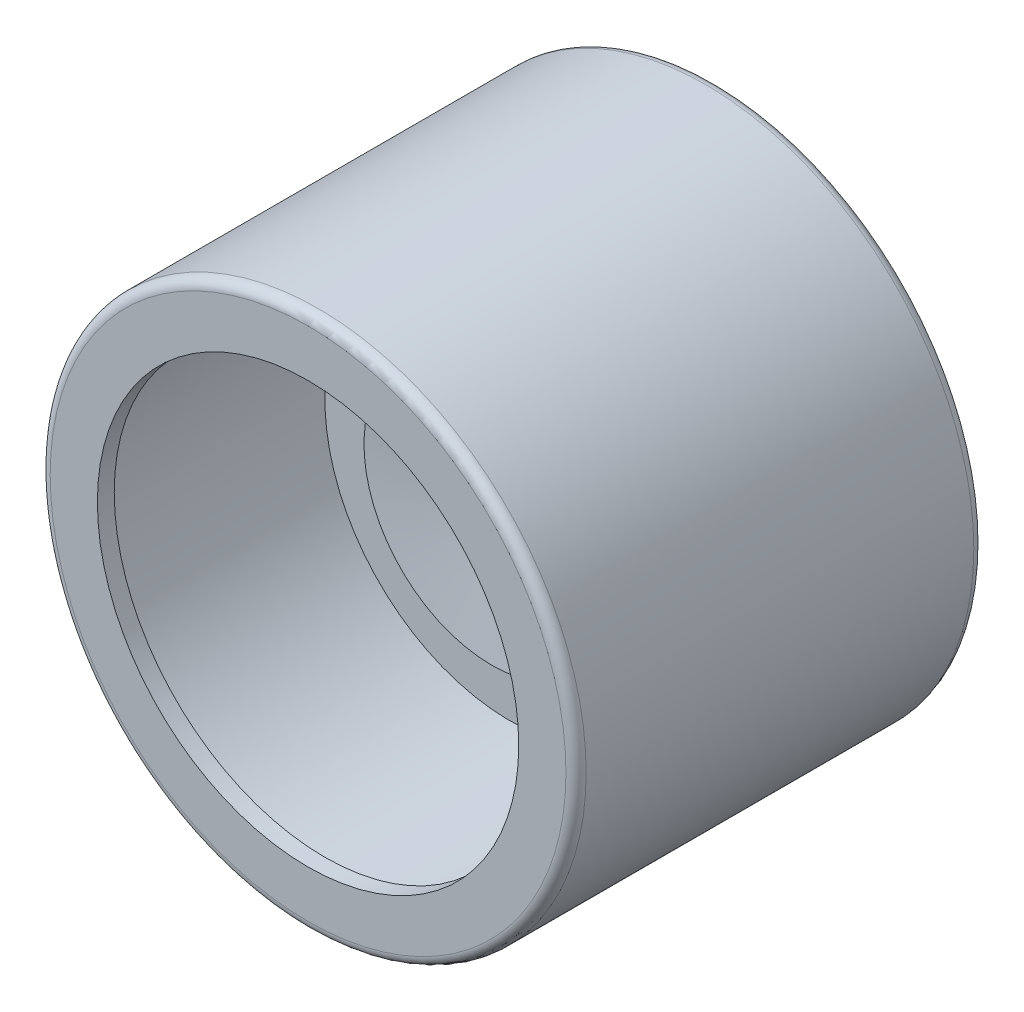
ISO-10303-21;
HEADER;
FILE_DESCRIPTION(('STEP AP214'),'2;1');
FILE_NAME('part.step','',(''),(''),'','','');
FILE_SCHEMA(('AUTOMOTIVE_DESIGN { 1 0 10303 214 1 1 1 1 }'));
ENDSEC;
DATA;
#1=APPLICATION_CONTEXT('core data for automotive mechanical design processes');
#2=APPLICATION_PROTOCOL_DEFINITION('international standard','automotive_design',2000,#1);
#3=PRODUCT_CONTEXT('',#1,'mechanical');
#4=PRODUCT('Part','Part','',(#3));
#5=PRODUCT_RELATED_PRODUCT_CATEGORY('part','',(#4));
#6=PRODUCT_DEFINITION_FORMATION('','',#4);
#7=PRODUCT_DEFINITION_CONTEXT('part definition',#1,'design');
#8=PRODUCT_DEFINITION('design','',#6,#7);
#9=PRODUCT_DEFINITION_SHAPE('','',#8);
#10=(LENGTH_UNIT() NAMED_UNIT(*) SI_UNIT(.MILLI.,.METRE.));
#11=(NAMED_UNIT(*) PLANE_ANGLE_UNIT() SI_UNIT($,.RADIAN.));
#12=(NAMED_UNIT(*) SI_UNIT($,.STERADIAN.) SOLID_ANGLE_UNIT());
#13=UNCERTAINTY_MEASURE_WITH_UNIT(LENGTH_MEASURE(1.E-05),#10,'distance_accuracy_value','');
#14=(GEOMETRIC_REPRESENTATION_CONTEXT(3) GLOBAL_UNCERTAINTY_ASSIGNED_CONTEXT((#13)) GLOBAL_UNIT_ASSIGNED_CONTEXT((#10,
#11,#12)) REPRESENTATION_CONTEXT('',''));
#15=CARTESIAN_POINT('',(0.,0.,0.));
#16=DIRECTION('',(0.,0.,1.));
#17=DIRECTION('',(1.,0.,0.));
#18=AXIS2_PLACEMENT_3D('',#15,#16,#17);
#19=CARTESIAN_POINT('',(0.,0.,6.1));
#20=DIRECTION('',(0.,0.,1.));
#21=DIRECTION('',(1.,0.,0.));
#22=AXIS2_PLACEMENT_3D('',#19,#20,#21);
#23=PLANE('',#22);
#24=CARTESIAN_POINT('',(0.,0.,6.1));
#25=DIRECTION('',(0.,0.,1.));
#26=DIRECTION('',(1.,0.,0.));
#27=AXIS2_PLACEMENT_3D('',#24,#25,#26);
#28=CIRCLE('',#27,5.5);
#29=CARTESIAN_POINT('',(5.5,0.,6.1));
#30=VERTEX_POINT('',#29);
#31=EDGE_CURVE('E80',#30,#30,#28,.T.);
#32=ORIENTED_EDGE('',*,*,#31,.T.);
#33=EDGE_LOOP('',(#32));
#34=FACE_BOUND('',#33,.T.);
#35=CARTESIAN_POINT('',(0.,0.,6.1));
#36=DIRECTION('',(0.,0.,1.));
#37=DIRECTION('',(1.,0.,0.));
#38=AXIS2_PLACEMENT_3D('',#35,#36,#37);
#39=CIRCLE('',#38,3.7909010050328);
#40=CARTESIAN_POINT('',(3.7909010050328,0.,6.1));
#41=VERTEX_POINT('',#40);
#42=EDGE_CURVE('E11',#41,#41,#39,.T.);
#43=ORIENTED_EDGE('',*,*,#42,.F.);
#44=EDGE_LOOP('',(#43));
#45=FACE_BOUND('',#44,.T.);
#46=ADVANCED_FACE('F44',(#34,#45),#23,.T.);
#47=CARTESIAN_POINT('',(0.,0.,12.1));
#48=DIRECTION('',(0.,0.,-1.));
#49=DIRECTION('',(-1.,0.,0.));
#50=AXIS2_PLACEMENT_3D('',#47,#48,#49);
#51=CYLINDRICAL_SURFACE('',#50,7.95);
#52=CARTESIAN_POINT('',(0.,0.,0.3));
#53=DIRECTION('',(0.,0.,1.));
#54=DIRECTION('',(1.,0.,0.));
#55=AXIS2_PLACEMENT_3D('',#52,#53,#54);
#56=CIRCLE('',#55,7.95);
#57=CARTESIAN_POINT('',(7.95,0.,0.3));
#58=VERTEX_POINT('',#57);
#59=EDGE_CURVE('E67',#58,#58,#56,.T.);
#60=ORIENTED_EDGE('',*,*,#59,.T.);
#61=EDGE_LOOP('',(#60));
#62=FACE_BOUND('',#61,.T.);
#63=CARTESIAN_POINT('',(0.,0.,11.8));
#64=DIRECTION('',(0.,0.,1.));
#65=DIRECTION('',(1.,0.,0.));
#66=AXIS2_PLACEMENT_3D('',#63,#64,#65);
#67=CIRCLE('',#66,7.95);
#68=CARTESIAN_POINT('',(7.95,0.,11.8));
#69=VERTEX_POINT('',#68);
#70=EDGE_CURVE('E70',#69,#69,#67,.F.);
#71=ORIENTED_EDGE('',*,*,#70,.T.);
#72=EDGE_LOOP('',(#71));
#73=FACE_BOUND('',#72,.T.);
#74=ADVANCED_FACE('F114',(#62,#73),#51,.T.);
#75=CARTESIAN_POINT('',(0.,0.,12.1));
#76=DIRECTION('',(0.,0.,1.));
#77=DIRECTION('',(1.,0.,0.));
#78=AXIS2_PLACEMENT_3D('',#75,#76,#77);
#79=PLANE('',#78);
#80=CARTESIAN_POINT('',(0.,0.,12.1));
#81=DIRECTION('',(0.,0.,1.));
#82=DIRECTION('',(1.,0.,0.));
#83=AXIS2_PLACEMENT_3D('',#80,#81,#82);
#84=CIRCLE('',#83,7.65);
#85=CARTESIAN_POINT('',(7.65,0.,12.1));
#86=VERTEX_POINT('',#85);
#87=EDGE_CURVE('E59',#86,#86,#84,.T.);
#88=ORIENTED_EDGE('',*,*,#87,.T.);
#89=EDGE_LOOP('',(#88));
#90=FACE_BOUND('',#89,.T.);
#91=CARTESIAN_POINT('',(0.,0.,12.1));
#92=DIRECTION('',(0.,0.,1.));
#93=DIRECTION('',(1.,0.,0.));
#94=AXIS2_PLACEMENT_3D('',#91,#92,#93);
#95=CIRCLE('',#94,6.25);
#96=CARTESIAN_POINT('',(6.25,0.,12.1));
#97=VERTEX_POINT('',#96);
#98=EDGE_CURVE('E77',#97,#97,#95,.T.);
#99=ORIENTED_EDGE('',*,*,#98,.F.);
#100=EDGE_LOOP('',(#99));
#101=FACE_BOUND('',#100,.T.);
#102=ADVANCED_FACE('F119',(#90,#101),#79,.T.);
#103=CARTESIAN_POINT('',(0.,0.,0.));
#104=DIRECTION('',(0.,0.,1.));
#105=DIRECTION('',(1.,0.,0.));
#106=AXIS2_PLACEMENT_3D('',#103,#104,#105);
#107=PLANE('',#106);
#108=CARTESIAN_POINT('',(0.,0.,0.));
#109=DIRECTION('',(0.,0.,1.));
#110=DIRECTION('',(1.,0.,0.));
#111=AXIS2_PLACEMENT_3D('',#108,#109,#110);
#112=CIRCLE('',#111,7.65);
#113=CARTESIAN_POINT('',(7.65,0.,0.));
#114=VERTEX_POINT('',#113);
#115=EDGE_CURVE('E64',#114,#114,#112,.F.);
#116=ORIENTED_EDGE('',*,*,#115,.T.);
#117=EDGE_LOOP('',(#116));
#118=FACE_BOUND('',#117,.T.);
#119=ADVANCED_FACE('F149',(#118),#107,.F.);
#120=CARTESIAN_POINT('',(0.,0.,0.3));
#121=DIRECTION('',(0.,0.,1.));
#122=DIRECTION('',(1.,0.,0.));
#123=AXIS2_PLACEMENT_3D('',#120,#121,#122);
#124=TOROIDAL_SURFACE('',#123,7.65,0.3);
#125=ORIENTED_EDGE('',*,*,#115,.F.);
#126=EDGE_LOOP('',(#125));
#127=FACE_BOUND('',#126,.T.);
#128=ORIENTED_EDGE('',*,*,#59,.F.);
#129=EDGE_LOOP('',(#128));
#130=FACE_BOUND('',#129,.T.);
#131=ADVANCED_FACE('F152',(#127,#130),#124,.T.);
#132=CARTESIAN_POINT('',(0.,0.,11.8));
#133=DIRECTION('',(0.,0.,1.));
#134=DIRECTION('',(1.,0.,0.));
#135=AXIS2_PLACEMENT_3D('',#132,#133,#134);
#136=TOROIDAL_SURFACE('',#135,7.65,0.3);
#137=ORIENTED_EDGE('',*,*,#70,.F.);
#138=EDGE_LOOP('',(#137));
#139=FACE_BOUND('',#138,.T.);
#140=ORIENTED_EDGE('',*,*,#87,.F.);
#141=EDGE_LOOP('',(#140));
#142=FACE_BOUND('',#141,.T.);
#143=ADVANCED_FACE('F46',(#139,#142),#136,.T.);
#144=CARTESIAN_POINT('',(0.,0.,11.6));
#145=DIRECTION('',(0.,0.,1.));
#146=DIRECTION('',(1.,0.,0.));
#147=AXIS2_PLACEMENT_3D('',#144,#145,#146);
#148=PLANE('',#147);
#149=CARTESIAN_POINT('',(0.,0.,11.6));
#150=DIRECTION('',(0.,0.,1.));
#151=DIRECTION('',(1.,0.,0.));
#152=AXIS2_PLACEMENT_3D('',#149,#150,#151);
#153=CIRCLE('',#152,6.25);
#154=CARTESIAN_POINT('',(6.25,0.,11.6));
#155=VERTEX_POINT('',#154);
#156=EDGE_CURVE('E76',#155,#155,#153,.T.);
#157=ORIENTED_EDGE('',*,*,#156,.T.);
#158=EDGE_LOOP('',(#157));
#159=FACE_BOUND('',#158,.T.);
#160=CARTESIAN_POINT('',(0.,0.,11.6));
#161=DIRECTION('',(0.,0.,1.));
#162=DIRECTION('',(1.,0.,0.));
#163=AXIS2_PLACEMENT_3D('',#160,#161,#162);
#164=CIRCLE('',#163,7.5);
#165=CARTESIAN_POINT('',(7.5,0.,11.6));
#166=VERTEX_POINT('',#165);
#167=EDGE_CURVE('E55',#166,#166,#164,.F.);
#168=ORIENTED_EDGE('',*,*,#167,.T.);
#169=EDGE_LOOP('',(#168));
#170=FACE_BOUND('',#169,.T.);
#171=ADVANCED_FACE('F136',(#159,#170),#148,.F.);
#172=CARTESIAN_POINT('',(0.,0.,11.6));
#173=DIRECTION('',(0.,0.,1.));
#174=DIRECTION('',(1.,0.,0.));
#175=AXIS2_PLACEMENT_3D('',#172,#173,#174);
#176=CYLINDRICAL_SURFACE('',#175,6.25);
#177=ORIENTED_EDGE('',*,*,#156,.F.);
#178=EDGE_LOOP('',(#177));
#179=FACE_BOUND('',#178,.T.);
#180=ORIENTED_EDGE('',*,*,#98,.T.);
#181=EDGE_LOOP('',(#180));
#182=FACE_BOUND('',#181,.T.);
#183=ADVANCED_FACE('F132',(#179,#182),#176,.F.);
#184=CARTESIAN_POINT('',(0.,0.,2.1));
#185=DIRECTION('',(0.,0.,1.));
#186=DIRECTION('',(1.,0.,0.));
#187=AXIS2_PLACEMENT_3D('',#184,#185,#186);
#188=PLANE('',#187);
#189=CARTESIAN_POINT('',(0.,0.,2.1));
#190=DIRECTION('',(0.,0.,1.));
#191=DIRECTION('',(1.,0.,0.));
#192=AXIS2_PLACEMENT_3D('',#189,#190,#191);
#193=CIRCLE('',#192,5.5);
#194=CARTESIAN_POINT('',(5.5,0.,2.1));
#195=VERTEX_POINT('',#194);
#196=EDGE_CURVE('E83',#195,#195,#193,.T.);
#197=ORIENTED_EDGE('',*,*,#196,.F.);
#198=EDGE_LOOP('',(#197));
#199=FACE_BOUND('',#198,.T.);
#200=CARTESIAN_POINT('',(0.,0.,2.1));
#201=DIRECTION('',(0.,0.,1.));
#202=DIRECTION('',(1.,0.,0.));
#203=AXIS2_PLACEMENT_3D('',#200,#201,#202);
#204=CIRCLE('',#203,7.5);
#205=CARTESIAN_POINT('',(7.5,0.,2.1));
#206=VERTEX_POINT('',#205);
#207=EDGE_CURVE('E73',#206,#206,#204,.T.);
#208=ORIENTED_EDGE('',*,*,#207,.T.);
#209=EDGE_LOOP('',(#208));
#210=FACE_BOUND('',#209,.T.);
#211=ADVANCED_FACE('F135',(#199,#210),#188,.T.);
#212=CARTESIAN_POINT('',(0.,0.,2.1));
#213=DIRECTION('',(0.,0.,1.));
#214=DIRECTION('',(1.,0.,0.));
#215=AXIS2_PLACEMENT_3D('',#212,#213,#214);
#216=CYLINDRICAL_SURFACE('',#215,7.5);
#217=ORIENTED_EDGE('',*,*,#207,.F.);
#218=EDGE_LOOP('',(#217));
#219=FACE_BOUND('',#218,.T.);
#220=ORIENTED_EDGE('',*,*,#167,.F.);
#221=EDGE_LOOP('',(#220));
#222=FACE_BOUND('',#221,.T.);
#223=ADVANCED_FACE('F130',(#219,#222),#216,.F.);
#224=CARTESIAN_POINT('',(0.,0.,6.1));
#225=DIRECTION('',(0.,0.,-1.));
#226=DIRECTION('',(-1.,0.,0.));
#227=AXIS2_PLACEMENT_3D('',#224,#225,#226);
#228=CYLINDRICAL_SURFACE('',#227,5.5);
#229=ORIENTED_EDGE('',*,*,#31,.F.);
#230=EDGE_LOOP('',(#229));
#231=FACE_BOUND('',#230,.T.);
#232=ORIENTED_EDGE('',*,*,#196,.T.);
#233=EDGE_LOOP('',(#232));
#234=FACE_BOUND('',#233,.T.);
#235=ADVANCED_FACE('F127',(#231,#234),#228,.T.);
#236=CARTESIAN_POINT('',(0.,0.,0.));
#237=DIRECTION('',(0.,0.,-1.));
#238=DIRECTION('',(0.,1.,0.));
#239=AXIS2_PLACEMENT_3D('',#236,#237,#238);
#240=CYLINDRICAL_SURFACE('',#239,3.7909010050328);
#241=ORIENTED_EDGE('',*,*,#42,.T.);
#242=EDGE_LOOP('',(#241));
#243=FACE_BOUND('',#242,.T.);
#244=CARTESIAN_POINT('',(0.,0.,6.65));
#245=DIRECTION('',(0.,0.,-1.));
#246=DIRECTION('',(0.,1.,0.));
#247=AXIS2_PLACEMENT_3D('',#244,#245,#246);
#248=CIRCLE('',#247,3.7909010050328);
#249=CARTESIAN_POINT('',(0.,-3.7909010050328,6.65));
#250=VERTEX_POINT('',#249);
#251=EDGE_CURVE('E86',#250,#250,#248,.T.);
#252=ORIENTED_EDGE('',*,*,#251,.T.);
#253=EDGE_LOOP('',(#252));
#254=FACE_BOUND('',#253,.T.);
#255=ADVANCED_FACE('F125',(#243,#254),#240,.T.);
#256=CARTESIAN_POINT('',(0.,0.,6.65));
#257=DIRECTION('',(0.,0.,1.));
#258=DIRECTION('',(0.,-1.,0.));
#259=AXIS2_PLACEMENT_3D('',#256,#257,#258);
#260=CONICAL_SURFACE('',#259,3.7909010050328,1.45108807305091);
#261=CARTESIAN_POINT('',(0.,0.,6.31884257165239));
#262=DIRECTION('',(0.,0.,-1.));
#263=DIRECTION('',(0.,1.,0.));
#264=AXIS2_PLACEMENT_3D('',#261,#262,#263);
#265=CIRCLE('',#264,1.03775684955081);
#266=CARTESIAN_POINT('',(0.,-1.03775684955081,6.31884257165239));
#267=VERTEX_POINT('',#266);
#268=EDGE_CURVE('E91',#267,#267,#265,.T.);
#269=CARTESIAN_POINT('',(0.,-1.03775684955081,6.31884257165239));
#270=CARTESIAN_POINT('',(0.,-1.06643543450375,6.32229212819768));
#271=CARTESIAN_POINT('',(0.,-1.09511401945669,6.32574168474297));
#272=CARTESIAN_POINT('',(0.,-1.15247118936256,6.33264079783354));
#273=CARTESIAN_POINT('',(0.,-1.1811497743155,6.33609035437883));
#274=CARTESIAN_POINT('',(0.,-1.23850694422137,6.3429894674694));
#275=CARTESIAN_POINT('',(0.,-1.26718552917431,6.34643902401469));
#276=CARTESIAN_POINT('',(0.,-1.32454269908018,6.35333813710527));
#277=CARTESIAN_POINT('',(0.,-1.35322128403312,6.35678769365055));
#278=CARTESIAN_POINT('',(0.,-1.410578453939,6.36368680674113));
#279=CARTESIAN_POINT('',(0.,-1.43925703889193,6.36713636328642));
#280=CARTESIAN_POINT('',(0.,-1.49661420879781,6.37403547637699));
#281=CARTESIAN_POINT('',(0.,-1.52529279375075,6.37748503292228));
#282=CARTESIAN_POINT('',(0.,-1.58264996365662,6.38438414601285));
#283=CARTESIAN_POINT('',(0.,-1.61132854860956,6.38783370255814));
#284=CARTESIAN_POINT('',(0.,-1.66868571851543,6.39473281564872));
#285=CARTESIAN_POINT('',(0.,-1.69736430346837,6.39818237219401));
#286=CARTESIAN_POINT('',(0.,-1.75472147337425,6.40508148528458));
#287=CARTESIAN_POINT('',(0.,-1.78340005832718,6.40853104182987));
#288=CARTESIAN_POINT('',(0.,-1.84075722823306,6.41543015492044));
#289=CARTESIAN_POINT('',(0.,-1.869435813186,6.41887971146573));
#290=CARTESIAN_POINT('',(0.,-1.92679298309187,6.42577882455631));
#291=CARTESIAN_POINT('',(0.,-1.95547156804481,6.42922838110159));
#292=CARTESIAN_POINT('',(0.,-2.01282873795068,6.43612749419217));
#293=CARTESIAN_POINT('',(0.,-2.04150732290362,6.43957705073746));
#294=CARTESIAN_POINT('',(0.,-2.09886449280949,6.44647616382803));
#295=CARTESIAN_POINT('',(0.,-2.12754307776243,6.44992572037332));
#296=CARTESIAN_POINT('',(0.,-2.18490024766831,6.45682483346389));
#297=CARTESIAN_POINT('',(0.,-2.21357883262124,6.46027439000918));
#298=CARTESIAN_POINT('',(0.,-2.27093600252712,6.46717350309976));
#299=CARTESIAN_POINT('',(0.,-2.29961458748006,6.47062305964505));
#300=CARTESIAN_POINT('',(0.,-2.35697175738593,6.47752217273562));
#301=CARTESIAN_POINT('',(0.,-2.38565034233887,6.48097172928091));
#302=CARTESIAN_POINT('',(0.,-2.44300751224474,6.48787084237148));
#303=CARTESIAN_POINT('',(0.,-2.47168609719768,6.49132039891677));
#304=CARTESIAN_POINT('',(0.,-2.52904326710356,6.49821951200734));
#305=CARTESIAN_POINT('',(0.,-2.55772185205649,6.50166906855263));
#306=CARTESIAN_POINT('',(0.,-2.61507902196237,6.50856818164321));
#307=CARTESIAN_POINT('',(0.,-2.64375760691531,6.5120177381885));
#308=CARTESIAN_POINT('',(0.,-2.70111477682118,6.51891685127907));
#309=CARTESIAN_POINT('',(0.,-2.72979336177412,6.52236640782436));
#310=CARTESIAN_POINT('',(0.,-2.78715053167999,6.52926552091493));
#311=CARTESIAN_POINT('',(0.,-2.81582911663293,6.53271507746022));
#312=CARTESIAN_POINT('',(0.,-2.8731862865388,6.5396141905508));
#313=CARTESIAN_POINT('',(0.,-2.90186487149174,6.54306374709608));
#314=CARTESIAN_POINT('',(0.,-2.95922204139762,6.54996286018666));
#315=CARTESIAN_POINT('',(0.,-2.98790062635055,6.55341241673195));
#316=CARTESIAN_POINT('',(0.,-3.04525779625643,6.56031152982252));
#317=CARTESIAN_POINT('',(0.,-3.07393638120937,6.56376108636781));
#318=CARTESIAN_POINT('',(0.,-3.13129355111524,6.57066019945838));
#319=CARTESIAN_POINT('',(0.,-3.15997213606818,6.57410975600367));
#320=CARTESIAN_POINT('',(0.,-3.21732930597405,6.58100886909425));
#321=CARTESIAN_POINT('',(0.,-3.24600789092699,6.58445842563954));
#322=CARTESIAN_POINT('',(0.,-3.30336506083287,6.59135753873011));
#323=CARTESIAN_POINT('',(0.,-3.3320436457858,6.5948070952754));
#324=CARTESIAN_POINT('',(0.,-3.38940081569168,6.60170620836597));
#325=CARTESIAN_POINT('',(0.,-3.41807940064461,6.60515576491126));
#326=CARTESIAN_POINT('',(0.,-3.47543657055049,6.61205487800184));
#327=CARTESIAN_POINT('',(0.,-3.50411515550343,6.61550443454712));
#328=CARTESIAN_POINT('',(0.,-3.5614723254093,6.6224035476377));
#329=CARTESIAN_POINT('',(0.,-3.59015091036224,6.62585310418299));
#330=CARTESIAN_POINT('',(0.,-3.64750808026811,6.63275221727356));
#331=CARTESIAN_POINT('',(0.,-3.67618666522105,6.63620177381885));
#332=CARTESIAN_POINT('',(0.,-3.73354383512693,6.64310088690942));
#333=CARTESIAN_POINT('',(0.,-3.76222242007986,6.64655044345471));
#334=CARTESIAN_POINT('',(0.,-3.7909010050328,6.65));
#335=B_SPLINE_CURVE_WITH_KNOTS('',3,(#269,#270,#271,#272,#273,#274,#275,#276,#277,#278,#279,
#280,#281,#282,#283,#284,#285,#286,#287,#288,#289,#290,#291,#292,#293,#294,#295,#296,#297,#298,
#299,#300,#301,#302,#303,#304,#305,#306,#307,#308,#309,#310,#311,#312,#313,#314,#315,#316,#317,
#318,#319,#320,#321,#322,#323,#324,#325,#326,#327,#328,#329,#330,#331,#332,#333,#334),
.UNSPECIFIED.,.F.,.F.,(4,2,2,2,2,2,2,2,2,2,2,2,2,2,2,2,2,2,2,2,2,2,2,2,2,2,2,2,2,2,2,2,4),(0.,
0.0866559061885451,0.17331181237709,0.259967718565634,0.346623624754179,0.433279530942724,
0.519935437131268,0.606591343319813,0.693247249508358,0.779903155696902,0.866559061885447,
0.953214968073992,1.03987087426254,1.12652678045108,1.21318268663963,1.29983859282817,
1.38649449901671,1.47315040520526,1.5598063113938,1.64646221758235,1.73311812377089,
1.81977402995944,1.90642993614798,1.99308584233653,2.07974174852507,2.16639765471362,
2.25305356090216,2.33970946709071,2.42636537327925,2.5130212794678,2.59967718565634,
2.68633309184488,2.77298899803343),.UNSPECIFIED.);
#336=EDGE_CURVE('BSEAM111',#267,#250,#335,.T.);
#337=ORIENTED_EDGE('',*,*,#268,.T.);
#338=ORIENTED_EDGE('',*,*,#251,.F.);
#339=ORIENTED_EDGE('',*,*,#336,.T.);
#340=ORIENTED_EDGE('',*,*,#336,.F.);
#341=EDGE_LOOP('',(#337,#339,#338,#340));
#342=FACE_BOUND('',#341,.T.);
#343=ADVANCED_FACE('F111',(#342),#260,.F.);
#344=CARTESIAN_POINT('',(0.,0.,4.82957729286775));
#345=DIRECTION('',(0.,0.,-1.));
#346=DIRECTION('',(0.,1.,0.));
#347=AXIS2_PLACEMENT_3D('',#344,#345,#346);
#348=DEGENERATE_TOROIDAL_SURFACE('',#347,1.21689068054462,1.5,.T.);
#349=CARTESIAN_POINT('',(0.,0.,6.1194532886291));
#350=DIRECTION('',(0.,0.,-1.));
#351=DIRECTION('',(0.,1.,0.));
#352=AXIS2_PLACEMENT_3D('',#349,#350,#351);
#353=CIRCLE('',#352,0.451240685077581);
#354=CARTESIAN_POINT('',(0.,0.45124068507758,6.1194532886291));
#355=VERTEX_POINT('',#354);
#356=EDGE_CURVE('E94',#355,#355,#353,.T.);
#357=ORIENTED_EDGE('',*,*,#356,.T.);
#358=EDGE_LOOP('',(#357));
#359=FACE_BOUND('',#358,.T.);
#360=ORIENTED_EDGE('',*,*,#268,.F.);
#361=EDGE_LOOP('',(#360));
#362=FACE_BOUND('',#361,.T.);
#363=ADVANCED_FACE('F98',(#359,#362),#348,.T.);
#364=CARTESIAN_POINT('',(0.,0.,6.1194532886291));
#365=DIRECTION('',(0.,0.,1.));
#366=DIRECTION('',(0.,-1.,0.));
#367=AXIS2_PLACEMENT_3D('',#364,#365,#366);
#368=CONICAL_SURFACE('',#367,0.451240685077581,1.0351076909461);
#369=CARTESIAN_POINT('',(0.,0.,6.1));
#370=DIRECTION('',(0.,0.,1.));
#371=DIRECTION('',(1.,0.,0.));
#372=AXIS2_PLACEMENT_3D('',#369,#370,#371);
#373=CIRCLE('',#372,0.418468099444649);
#374=CARTESIAN_POINT('',(0.418468099444649,0.,6.1));
#375=VERTEX_POINT('',#374);
#376=EDGE_CURVE('E51',#375,#375,#373,.F.);
#377=ORIENTED_EDGE('',*,*,#376,.T.);
#378=EDGE_LOOP('',(#377));
#379=FACE_BOUND('',#378,.T.);
#380=ORIENTED_EDGE('',*,*,#356,.F.);
#381=EDGE_LOOP('',(#380));
#382=FACE_BOUND('',#381,.T.);
#383=ADVANCED_FACE('F101',(#379,#382),#368,.F.);
#384=ORIENTED_EDGE('',*,*,#376,.F.);
#385=EDGE_LOOP('',(#384));
#386=FACE_BOUND('',#385,.T.);
#387=ADVANCED_FACE('F103',(#386),#23,.T.);
#388=CLOSED_SHELL('',(#46,#74,#102,#119,#131,#143,#171,#183,#211,#223,#235,#255,#343,#363,#383,#387));
#389=MANIFOLD_SOLID_BREP('B2',#388);
#390=ADVANCED_BREP_SHAPE_REPRESENTATION('',(#18,#389),#14);
#391=SHAPE_DEFINITION_REPRESENTATION(#9,#390);
ENDSEC;
END-ISO-10303-21;
